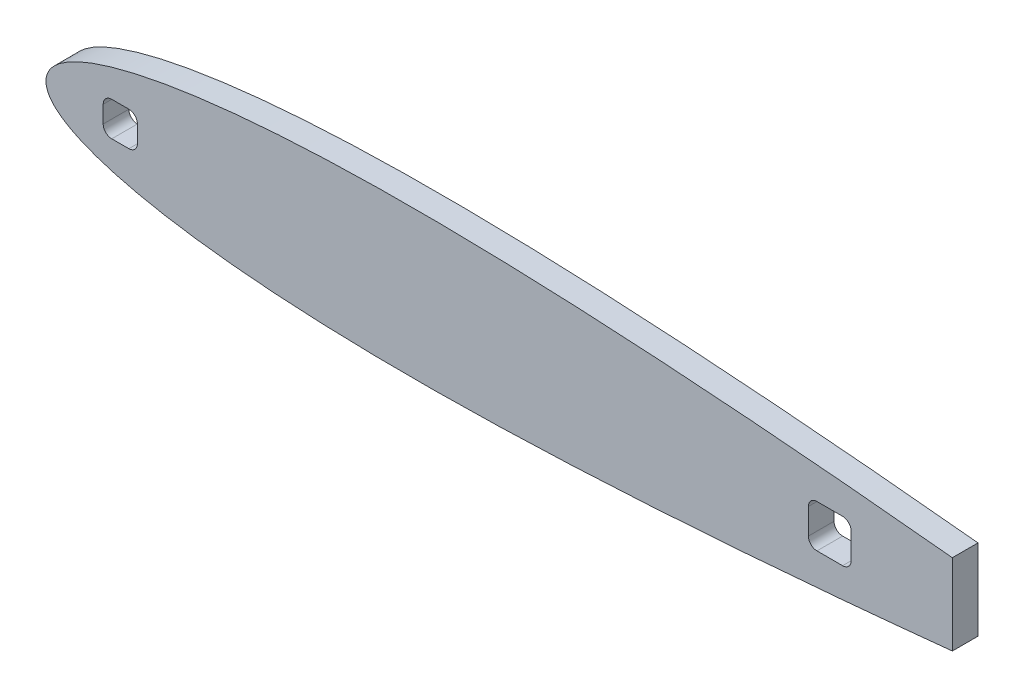
ISO-10303-21;
HEADER;
FILE_DESCRIPTION(('STEP AP214'),'2;1');
FILE_NAME('part.step','',(''),(''),'','','');
FILE_SCHEMA(('AUTOMOTIVE_DESIGN { 1 0 10303 214 1 1 1 1 }'));
ENDSEC;
DATA;
#1=APPLICATION_CONTEXT('core data for automotive mechanical design processes');
#2=APPLICATION_PROTOCOL_DEFINITION('international standard','automotive_design',2000,#1);
#3=PRODUCT_CONTEXT('',#1,'mechanical');
#4=PRODUCT('Part','Part','',(#3));
#5=PRODUCT_RELATED_PRODUCT_CATEGORY('part','',(#4));
#6=PRODUCT_DEFINITION_FORMATION('','',#4);
#7=PRODUCT_DEFINITION_CONTEXT('part definition',#1,'design');
#8=PRODUCT_DEFINITION('design','',#6,#7);
#9=PRODUCT_DEFINITION_SHAPE('','',#8);
#10=(LENGTH_UNIT() NAMED_UNIT(*) SI_UNIT(.MILLI.,.METRE.));
#11=(NAMED_UNIT(*) PLANE_ANGLE_UNIT() SI_UNIT($,.RADIAN.));
#12=(NAMED_UNIT(*) SI_UNIT($,.STERADIAN.) SOLID_ANGLE_UNIT());
#13=UNCERTAINTY_MEASURE_WITH_UNIT(LENGTH_MEASURE(1.E-05),#10,'distance_accuracy_value','');
#14=(GEOMETRIC_REPRESENTATION_CONTEXT(3) GLOBAL_UNCERTAINTY_ASSIGNED_CONTEXT((#13)) GLOBAL_UNIT_ASSIGNED_CONTEXT((#10,
#11,#12)) REPRESENTATION_CONTEXT('',''));
#15=CARTESIAN_POINT('',(0.,0.,0.));
#16=DIRECTION('',(0.,0.,1.));
#17=DIRECTION('',(1.,0.,0.));
#18=AXIS2_PLACEMENT_3D('',#15,#16,#17);
#19=CARTESIAN_POINT('',(211.979999999811,5.60261101752977E-12,6.));
#20=DIRECTION('',(1.,0.,0.));
#21=DIRECTION('',(0.,1.,0.));
#22=AXIS2_PLACEMENT_3D('',#19,#20,#21);
#23=PLANE('',#22);
#24=DIRECTION('',(0.,-1.,0.));
#25=VECTOR('',#24,1.);
#26=CARTESIAN_POINT('',(211.979999999811,5.60261101752977E-12,0.));
#27=LINE('',#26,#25);
#28=CARTESIAN_POINT('',(211.97999999981,9.45142222176065,0.));
#29=VERTEX_POINT('',#28);
#30=CARTESIAN_POINT('',(211.979999999811,-9.45142222176061,0.));
#31=VERTEX_POINT('',#30);
#32=EDGE_CURVE('E342',#29,#31,#27,.T.);
#33=ORIENTED_EDGE('',*,*,#32,.F.);
#34=DIRECTION('',(0.,0.,-1.));
#35=VECTOR('',#34,1.);
#36=CARTESIAN_POINT('',(211.97999999981,9.45142222176065,6.));
#37=LINE('',#36,#35);
#38=CARTESIAN_POINT('',(211.97999999981,9.45142222176065,6.));
#39=VERTEX_POINT('',#38);
#40=EDGE_CURVE('E11',#39,#29,#37,.T.);
#41=ORIENTED_EDGE('',*,*,#40,.F.);
#42=DIRECTION('',(0.,-1.,0.));
#43=VECTOR('',#42,1.);
#44=CARTESIAN_POINT('',(211.979999999811,5.60261101752977E-12,6.));
#45=LINE('',#44,#43);
#46=CARTESIAN_POINT('',(211.979999999811,-9.45142222176061,6.));
#47=VERTEX_POINT('',#46);
#48=EDGE_CURVE('E180',#39,#47,#45,.T.);
#49=ORIENTED_EDGE('',*,*,#48,.T.);
#50=DIRECTION('',(0.,0.,-1.));
#51=VECTOR('',#50,1.);
#52=CARTESIAN_POINT('',(211.979999999811,-9.45142222176061,6.));
#53=LINE('',#52,#51);
#54=EDGE_CURVE('E45',#47,#31,#53,.T.);
#55=ORIENTED_EDGE('',*,*,#54,.T.);
#56=EDGE_LOOP('',(#33,#41,#49,#55));
#57=FACE_BOUND('',#56,.T.);
#58=ADVANCED_FACE('F35',(#57),#23,.T.);
#59=CARTESIAN_POINT('',(13.38,0.,6.));
#60=DIRECTION('',(-1.,0.,0.));
#61=DIRECTION('',(0.,0.,1.));
#62=AXIS2_PLACEMENT_3D('',#59,#60,#61);
#63=PLANE('',#62);
#64=DIRECTION('',(0.,1.,0.));
#65=VECTOR('',#64,1.);
#66=CARTESIAN_POINT('',(13.38,0.,0.));
#67=LINE('',#66,#65);
#68=CARTESIAN_POINT('',(13.38,-1.99999999999999,0.));
#69=VERTEX_POINT('',#68);
#70=CARTESIAN_POINT('',(13.38,1.99999999999998,0.));
#71=VERTEX_POINT('',#70);
#72=EDGE_CURVE('E323',#69,#71,#67,.T.);
#73=ORIENTED_EDGE('',*,*,#72,.T.);
#74=DIRECTION('',(0.,0.,-1.));
#75=VECTOR('',#74,1.);
#76=CARTESIAN_POINT('',(13.38,1.99999999999998,6.));
#77=LINE('',#76,#75);
#78=CARTESIAN_POINT('',(13.38,1.99999999999998,6.));
#79=VERTEX_POINT('',#78);
#80=EDGE_CURVE('E194',#79,#71,#77,.T.);
#81=ORIENTED_EDGE('',*,*,#80,.F.);
#82=DIRECTION('',(0.,1.,0.));
#83=VECTOR('',#82,1.);
#84=CARTESIAN_POINT('',(13.38,0.,6.));
#85=LINE('',#84,#83);
#86=CARTESIAN_POINT('',(13.38,-1.99999999999999,6.));
#87=VERTEX_POINT('',#86);
#88=EDGE_CURVE('E174',#87,#79,#85,.T.);
#89=ORIENTED_EDGE('',*,*,#88,.F.);
#90=DIRECTION('',(0.,0.,-1.));
#91=VECTOR('',#90,1.);
#92=CARTESIAN_POINT('',(13.38,-1.99999999999999,6.));
#93=LINE('',#92,#91);
#94=EDGE_CURVE('E183',#87,#69,#93,.T.);
#95=ORIENTED_EDGE('',*,*,#94,.T.);
#96=EDGE_LOOP('',(#73,#81,#89,#95));
#97=FACE_BOUND('',#96,.T.);
#98=ADVANCED_FACE('F192',(#97),#63,.F.);
#99=CARTESIAN_POINT('',(15.38,2.,6.));
#100=DIRECTION('',(0.,0.,-1.));
#101=DIRECTION('',(-1.,0.,0.));
#102=AXIS2_PLACEMENT_3D('',#99,#100,#101);
#103=CYLINDRICAL_SURFACE('',#102,2.);
#104=CARTESIAN_POINT('',(15.38,2.,0.));
#105=DIRECTION('',(0.,0.,1.));
#106=DIRECTION('',(1.,0.,0.));
#107=AXIS2_PLACEMENT_3D('',#104,#105,#106);
#108=CIRCLE('',#107,2.);
#109=CARTESIAN_POINT('',(15.38,4.,0.));
#110=VERTEX_POINT('',#109);
#111=EDGE_CURVE('E325',#71,#110,#108,.F.);
#112=ORIENTED_EDGE('',*,*,#111,.T.);
#113=DIRECTION('',(0.,0.,-1.));
#114=VECTOR('',#113,1.);
#115=CARTESIAN_POINT('',(15.38,4.,6.));
#116=LINE('',#115,#114);
#117=CARTESIAN_POINT('',(15.38,4.,6.));
#118=VERTEX_POINT('',#117);
#119=EDGE_CURVE('E364',#118,#110,#116,.T.);
#120=ORIENTED_EDGE('',*,*,#119,.F.);
#121=CARTESIAN_POINT('',(15.38,2.,6.));
#122=DIRECTION('',(0.,0.,1.));
#123=DIRECTION('',(1.,0.,0.));
#124=AXIS2_PLACEMENT_3D('',#121,#122,#123);
#125=CIRCLE('',#124,2.);
#126=EDGE_CURVE('E195',#79,#118,#125,.F.);
#127=ORIENTED_EDGE('',*,*,#126,.F.);
#128=ORIENTED_EDGE('',*,*,#80,.T.);
#129=EDGE_LOOP('',(#112,#120,#127,#128));
#130=FACE_BOUND('',#129,.T.);
#131=ADVANCED_FACE('F257',(#130),#103,.F.);
#132=CARTESIAN_POINT('',(0.,4.,6.));
#133=DIRECTION('',(0.,1.,0.));
#134=DIRECTION('',(0.,0.,1.));
#135=AXIS2_PLACEMENT_3D('',#132,#133,#134);
#136=PLANE('',#135);
#137=DIRECTION('',(1.,0.,0.));
#138=VECTOR('',#137,1.);
#139=CARTESIAN_POINT('',(0.,4.,0.));
#140=LINE('',#139,#138);
#141=CARTESIAN_POINT('',(19.38,4.,0.));
#142=VERTEX_POINT('',#141);
#143=EDGE_CURVE('E327',#110,#142,#140,.T.);
#144=ORIENTED_EDGE('',*,*,#143,.T.);
#145=DIRECTION('',(0.,0.,-1.));
#146=VECTOR('',#145,1.);
#147=CARTESIAN_POINT('',(19.38,4.,6.));
#148=LINE('',#147,#146);
#149=CARTESIAN_POINT('',(19.38,4.,6.));
#150=VERTEX_POINT('',#149);
#151=EDGE_CURVE('E361',#150,#142,#148,.T.);
#152=ORIENTED_EDGE('',*,*,#151,.F.);
#153=DIRECTION('',(1.,0.,0.));
#154=VECTOR('',#153,1.);
#155=CARTESIAN_POINT('',(0.,4.,6.));
#156=LINE('',#155,#154);
#157=EDGE_CURVE('E198',#118,#150,#156,.T.);
#158=ORIENTED_EDGE('',*,*,#157,.F.);
#159=ORIENTED_EDGE('',*,*,#119,.T.);
#160=EDGE_LOOP('',(#144,#152,#158,#159));
#161=FACE_BOUND('',#160,.T.);
#162=ADVANCED_FACE('F253',(#161),#136,.F.);
#163=CARTESIAN_POINT('',(19.38,2.,6.));
#164=DIRECTION('',(0.,0.,-1.));
#165=DIRECTION('',(-1.,0.,0.));
#166=AXIS2_PLACEMENT_3D('',#163,#164,#165);
#167=CYLINDRICAL_SURFACE('',#166,2.);
#168=CARTESIAN_POINT('',(19.38,2.,0.));
#169=DIRECTION('',(0.,0.,1.));
#170=DIRECTION('',(1.,0.,0.));
#171=AXIS2_PLACEMENT_3D('',#168,#169,#170);
#172=CIRCLE('',#171,2.);
#173=CARTESIAN_POINT('',(21.38,1.99999999999998,0.));
#174=VERTEX_POINT('',#173);
#175=EDGE_CURVE('E329',#142,#174,#172,.F.);
#176=ORIENTED_EDGE('',*,*,#175,.T.);
#177=DIRECTION('',(0.,0.,-1.));
#178=VECTOR('',#177,1.);
#179=CARTESIAN_POINT('',(21.38,1.99999999999998,6.));
#180=LINE('',#179,#178);
#181=CARTESIAN_POINT('',(21.38,1.99999999999998,6.));
#182=VERTEX_POINT('',#181);
#183=EDGE_CURVE('E359',#182,#174,#180,.T.);
#184=ORIENTED_EDGE('',*,*,#183,.F.);
#185=CARTESIAN_POINT('',(19.38,2.,6.));
#186=DIRECTION('',(0.,0.,1.));
#187=DIRECTION('',(1.,0.,0.));
#188=AXIS2_PLACEMENT_3D('',#185,#186,#187);
#189=CIRCLE('',#188,2.);
#190=EDGE_CURVE('E205',#150,#182,#189,.F.);
#191=ORIENTED_EDGE('',*,*,#190,.F.);
#192=ORIENTED_EDGE('',*,*,#151,.T.);
#193=EDGE_LOOP('',(#176,#184,#191,#192));
#194=FACE_BOUND('',#193,.T.);
#195=ADVANCED_FACE('F249',(#194),#167,.F.);
#196=CARTESIAN_POINT('',(21.38,0.,6.));
#197=DIRECTION('',(-1.,0.,0.));
#198=DIRECTION('',(0.,0.,1.));
#199=AXIS2_PLACEMENT_3D('',#196,#197,#198);
#200=PLANE('',#199);
#201=DIRECTION('',(0.,1.,0.));
#202=VECTOR('',#201,1.);
#203=CARTESIAN_POINT('',(21.38,0.,0.));
#204=LINE('',#203,#202);
#205=CARTESIAN_POINT('',(21.38,-1.99999999999999,0.));
#206=VERTEX_POINT('',#205);
#207=EDGE_CURVE('E332',#206,#174,#204,.T.);
#208=ORIENTED_EDGE('',*,*,#207,.F.);
#209=DIRECTION('',(0.,0.,-1.));
#210=VECTOR('',#209,1.);
#211=CARTESIAN_POINT('',(21.38,-1.99999999999999,6.));
#212=LINE('',#211,#210);
#213=CARTESIAN_POINT('',(21.38,-1.99999999999999,6.));
#214=VERTEX_POINT('',#213);
#215=EDGE_CURVE('E357',#214,#206,#212,.T.);
#216=ORIENTED_EDGE('',*,*,#215,.F.);
#217=DIRECTION('',(0.,1.,0.));
#218=VECTOR('',#217,1.);
#219=CARTESIAN_POINT('',(21.38,0.,6.));
#220=LINE('',#219,#218);
#221=EDGE_CURVE('E207',#214,#182,#220,.T.);
#222=ORIENTED_EDGE('',*,*,#221,.T.);
#223=ORIENTED_EDGE('',*,*,#183,.T.);
#224=EDGE_LOOP('',(#208,#216,#222,#223));
#225=FACE_BOUND('',#224,.T.);
#226=ADVANCED_FACE('F245',(#225),#200,.T.);
#227=CARTESIAN_POINT('',(19.38,-2.,6.));
#228=DIRECTION('',(0.,0.,-1.));
#229=DIRECTION('',(-1.,0.,0.));
#230=AXIS2_PLACEMENT_3D('',#227,#228,#229);
#231=CYLINDRICAL_SURFACE('',#230,2.);
#232=CARTESIAN_POINT('',(19.38,-2.,0.));
#233=DIRECTION('',(0.,0.,1.));
#234=DIRECTION('',(1.,0.,0.));
#235=AXIS2_PLACEMENT_3D('',#232,#233,#234);
#236=CIRCLE('',#235,2.);
#237=CARTESIAN_POINT('',(19.38,-4.,0.));
#238=VERTEX_POINT('',#237);
#239=EDGE_CURVE('E335',#238,#206,#236,.T.);
#240=ORIENTED_EDGE('',*,*,#239,.F.);
#241=DIRECTION('',(0.,0.,-1.));
#242=VECTOR('',#241,1.);
#243=CARTESIAN_POINT('',(19.38,-4.,6.));
#244=LINE('',#243,#242);
#245=CARTESIAN_POINT('',(19.38,-4.,6.));
#246=VERTEX_POINT('',#245);
#247=EDGE_CURVE('E355',#246,#238,#244,.T.);
#248=ORIENTED_EDGE('',*,*,#247,.F.);
#249=CARTESIAN_POINT('',(19.38,-2.,6.));
#250=DIRECTION('',(0.,0.,1.));
#251=DIRECTION('',(1.,0.,0.));
#252=AXIS2_PLACEMENT_3D('',#249,#250,#251);
#253=CIRCLE('',#252,2.);
#254=EDGE_CURVE('E210',#246,#214,#253,.T.);
#255=ORIENTED_EDGE('',*,*,#254,.T.);
#256=ORIENTED_EDGE('',*,*,#215,.T.);
#257=EDGE_LOOP('',(#240,#248,#255,#256));
#258=FACE_BOUND('',#257,.T.);
#259=ADVANCED_FACE('F241',(#258),#231,.F.);
#260=CARTESIAN_POINT('',(0.,-4.,6.));
#261=DIRECTION('',(0.,1.,0.));
#262=DIRECTION('',(0.,0.,1.));
#263=AXIS2_PLACEMENT_3D('',#260,#261,#262);
#264=PLANE('',#263);
#265=DIRECTION('',(1.,0.,0.));
#266=VECTOR('',#265,1.);
#267=CARTESIAN_POINT('',(0.,-4.,0.));
#268=LINE('',#267,#266);
#269=CARTESIAN_POINT('',(15.38,-4.,0.));
#270=VERTEX_POINT('',#269);
#271=EDGE_CURVE('E338',#270,#238,#268,.T.);
#272=ORIENTED_EDGE('',*,*,#271,.F.);
#273=DIRECTION('',(0.,0.,-1.));
#274=VECTOR('',#273,1.);
#275=CARTESIAN_POINT('',(15.38,-4.,6.));
#276=LINE('',#275,#274);
#277=CARTESIAN_POINT('',(15.38,-4.,6.));
#278=VERTEX_POINT('',#277);
#279=EDGE_CURVE('E190',#278,#270,#276,.T.);
#280=ORIENTED_EDGE('',*,*,#279,.F.);
#281=DIRECTION('',(1.,0.,0.));
#282=VECTOR('',#281,1.);
#283=CARTESIAN_POINT('',(0.,-4.,6.));
#284=LINE('',#283,#282);
#285=EDGE_CURVE('E178',#278,#246,#284,.T.);
#286=ORIENTED_EDGE('',*,*,#285,.T.);
#287=ORIENTED_EDGE('',*,*,#247,.T.);
#288=EDGE_LOOP('',(#272,#280,#286,#287));
#289=FACE_BOUND('',#288,.T.);
#290=ADVANCED_FACE('F238',(#289),#264,.T.);
#291=CARTESIAN_POINT('',(178.31333333,0.,6.));
#292=DIRECTION('',(-1.,0.,0.));
#293=DIRECTION('',(0.,0.,1.));
#294=AXIS2_PLACEMENT_3D('',#291,#292,#293);
#295=PLANE('',#294);
#296=DIRECTION('',(0.,1.,0.));
#297=VECTOR('',#296,1.);
#298=CARTESIAN_POINT('',(178.31333333,0.,0.));
#299=LINE('',#298,#297);
#300=CARTESIAN_POINT('',(178.31333333,-3.,0.));
#301=VERTEX_POINT('',#300);
#302=CARTESIAN_POINT('',(178.31333333,2.99999999999997,0.));
#303=VERTEX_POINT('',#302);
#304=EDGE_CURVE('E220',#301,#303,#299,.T.);
#305=ORIENTED_EDGE('',*,*,#304,.T.);
#306=DIRECTION('',(0.,0.,-1.));
#307=VECTOR('',#306,1.);
#308=CARTESIAN_POINT('',(178.31333333,2.99999999999997,6.));
#309=LINE('',#308,#307);
#310=CARTESIAN_POINT('',(178.31333333,2.99999999999997,6.));
#311=VERTEX_POINT('',#310);
#312=EDGE_CURVE('E39',#311,#303,#309,.T.);
#313=ORIENTED_EDGE('',*,*,#312,.F.);
#314=DIRECTION('',(0.,1.,0.));
#315=VECTOR('',#314,1.);
#316=CARTESIAN_POINT('',(178.31333333,0.,6.));
#317=LINE('',#316,#315);
#318=CARTESIAN_POINT('',(178.31333333,-3.,6.));
#319=VERTEX_POINT('',#318);
#320=EDGE_CURVE('E349',#319,#311,#317,.T.);
#321=ORIENTED_EDGE('',*,*,#320,.F.);
#322=DIRECTION('',(0.,0.,-1.));
#323=VECTOR('',#322,1.);
#324=CARTESIAN_POINT('',(178.31333333,-3.,6.));
#325=LINE('',#324,#323);
#326=EDGE_CURVE('E219',#319,#301,#325,.T.);
#327=ORIENTED_EDGE('',*,*,#326,.T.);
#328=EDGE_LOOP('',(#305,#313,#321,#327));
#329=FACE_BOUND('',#328,.T.);
#330=ADVANCED_FACE('F37',(#329),#295,.F.);
#331=CARTESIAN_POINT('',(180.31333333,2.99999999999999,6.));
#332=DIRECTION('',(0.,0.,-1.));
#333=DIRECTION('',(-1.,0.,0.));
#334=AXIS2_PLACEMENT_3D('',#331,#332,#333);
#335=CYLINDRICAL_SURFACE('',#334,2.);
#336=CARTESIAN_POINT('',(180.31333333,2.99999999999999,0.));
#337=DIRECTION('',(0.,0.,1.));
#338=DIRECTION('',(1.,0.,0.));
#339=AXIS2_PLACEMENT_3D('',#336,#337,#338);
#340=CIRCLE('',#339,2.);
#341=CARTESIAN_POINT('',(180.31333333,4.99999999999999,0.));
#342=VERTEX_POINT('',#341);
#343=EDGE_CURVE('E291',#303,#342,#340,.F.);
#344=ORIENTED_EDGE('',*,*,#343,.T.);
#345=DIRECTION('',(0.,0.,-1.));
#346=VECTOR('',#345,1.);
#347=CARTESIAN_POINT('',(180.31333333,4.99999999999999,6.));
#348=LINE('',#347,#346);
#349=CARTESIAN_POINT('',(180.31333333,4.99999999999999,6.));
#350=VERTEX_POINT('',#349);
#351=EDGE_CURVE('E293',#350,#342,#348,.T.);
#352=ORIENTED_EDGE('',*,*,#351,.F.);
#353=CARTESIAN_POINT('',(180.31333333,2.99999999999999,6.));
#354=DIRECTION('',(0.,0.,1.));
#355=DIRECTION('',(1.,0.,0.));
#356=AXIS2_PLACEMENT_3D('',#353,#354,#355);
#357=CIRCLE('',#356,2.);
#358=EDGE_CURVE('E123',#311,#350,#357,.F.);
#359=ORIENTED_EDGE('',*,*,#358,.F.);
#360=ORIENTED_EDGE('',*,*,#312,.T.);
#361=EDGE_LOOP('',(#344,#352,#359,#360));
#362=FACE_BOUND('',#361,.T.);
#363=ADVANCED_FACE('F284',(#362),#335,.F.);
#364=CARTESIAN_POINT('',(0.,4.99999999999999,6.));
#365=DIRECTION('',(0.,1.,0.));
#366=DIRECTION('',(0.,0.,1.));
#367=AXIS2_PLACEMENT_3D('',#364,#365,#366);
#368=PLANE('',#367);
#369=DIRECTION('',(1.,0.,0.));
#370=VECTOR('',#369,1.);
#371=CARTESIAN_POINT('',(0.,4.99999999999999,0.));
#372=LINE('',#371,#370);
#373=CARTESIAN_POINT('',(186.31333333,4.99999999999999,0.));
#374=VERTEX_POINT('',#373);
#375=EDGE_CURVE('E300',#342,#374,#372,.T.);
#376=ORIENTED_EDGE('',*,*,#375,.T.);
#377=DIRECTION('',(0.,0.,-1.));
#378=VECTOR('',#377,1.);
#379=CARTESIAN_POINT('',(186.31333333,4.99999999999999,6.));
#380=LINE('',#379,#378);
#381=CARTESIAN_POINT('',(186.31333333,4.99999999999999,6.));
#382=VERTEX_POINT('',#381);
#383=EDGE_CURVE('E304',#382,#374,#380,.T.);
#384=ORIENTED_EDGE('',*,*,#383,.F.);
#385=DIRECTION('',(1.,0.,0.));
#386=VECTOR('',#385,1.);
#387=CARTESIAN_POINT('',(0.,4.99999999999999,6.));
#388=LINE('',#387,#386);
#389=EDGE_CURVE('E303',#350,#382,#388,.T.);
#390=ORIENTED_EDGE('',*,*,#389,.F.);
#391=ORIENTED_EDGE('',*,*,#351,.T.);
#392=EDGE_LOOP('',(#376,#384,#390,#391));
#393=FACE_BOUND('',#392,.T.);
#394=ADVANCED_FACE('F281',(#393),#368,.F.);
#395=CARTESIAN_POINT('',(186.31333333,2.99999999999999,6.));
#396=DIRECTION('',(0.,0.,-1.));
#397=DIRECTION('',(-1.,0.,0.));
#398=AXIS2_PLACEMENT_3D('',#395,#396,#397);
#399=CYLINDRICAL_SURFACE('',#398,2.);
#400=CARTESIAN_POINT('',(186.31333333,2.99999999999999,0.));
#401=DIRECTION('',(0.,0.,1.));
#402=DIRECTION('',(1.,0.,0.));
#403=AXIS2_PLACEMENT_3D('',#400,#401,#402);
#404=CIRCLE('',#403,2.);
#405=CARTESIAN_POINT('',(188.31333333,2.99999999999997,0.));
#406=VERTEX_POINT('',#405);
#407=EDGE_CURVE('E309',#374,#406,#404,.F.);
#408=ORIENTED_EDGE('',*,*,#407,.T.);
#409=DIRECTION('',(0.,0.,-1.));
#410=VECTOR('',#409,1.);
#411=CARTESIAN_POINT('',(188.31333333,2.99999999999997,6.));
#412=LINE('',#411,#410);
#413=CARTESIAN_POINT('',(188.31333333,2.99999999999997,6.));
#414=VERTEX_POINT('',#413);
#415=EDGE_CURVE('E376',#414,#406,#412,.T.);
#416=ORIENTED_EDGE('',*,*,#415,.F.);
#417=CARTESIAN_POINT('',(186.31333333,2.99999999999999,6.));
#418=DIRECTION('',(0.,0.,1.));
#419=DIRECTION('',(1.,0.,0.));
#420=AXIS2_PLACEMENT_3D('',#417,#418,#419);
#421=CIRCLE('',#420,2.);
#422=EDGE_CURVE('E380',#382,#414,#421,.F.);
#423=ORIENTED_EDGE('',*,*,#422,.F.);
#424=ORIENTED_EDGE('',*,*,#383,.T.);
#425=EDGE_LOOP('',(#408,#416,#423,#424));
#426=FACE_BOUND('',#425,.T.);
#427=ADVANCED_FACE('F277',(#426),#399,.F.);
#428=CARTESIAN_POINT('',(188.31333333,0.,6.));
#429=DIRECTION('',(-1.,0.,0.));
#430=DIRECTION('',(0.,0.,1.));
#431=AXIS2_PLACEMENT_3D('',#428,#429,#430);
#432=PLANE('',#431);
#433=DIRECTION('',(0.,1.,0.));
#434=VECTOR('',#433,1.);
#435=CARTESIAN_POINT('',(188.31333333,0.,0.));
#436=LINE('',#435,#434);
#437=CARTESIAN_POINT('',(188.31333333,-3.,0.));
#438=VERTEX_POINT('',#437);
#439=EDGE_CURVE('E311',#438,#406,#436,.T.);
#440=ORIENTED_EDGE('',*,*,#439,.F.);
#441=DIRECTION('',(0.,0.,-1.));
#442=VECTOR('',#441,1.);
#443=CARTESIAN_POINT('',(188.31333333,-3.,6.));
#444=LINE('',#443,#442);
#445=CARTESIAN_POINT('',(188.31333333,-3.,6.));
#446=VERTEX_POINT('',#445);
#447=EDGE_CURVE('E374',#446,#438,#444,.T.);
#448=ORIENTED_EDGE('',*,*,#447,.F.);
#449=DIRECTION('',(0.,1.,0.));
#450=VECTOR('',#449,1.);
#451=CARTESIAN_POINT('',(188.31333333,0.,6.));
#452=LINE('',#451,#450);
#453=EDGE_CURVE('E384',#446,#414,#452,.T.);
#454=ORIENTED_EDGE('',*,*,#453,.T.);
#455=ORIENTED_EDGE('',*,*,#415,.T.);
#456=EDGE_LOOP('',(#440,#448,#454,#455));
#457=FACE_BOUND('',#456,.T.);
#458=ADVANCED_FACE('F273',(#457),#432,.T.);
#459=CARTESIAN_POINT('',(186.31333333,-3.00000000000001,6.));
#460=DIRECTION('',(0.,0.,-1.));
#461=DIRECTION('',(-1.,0.,0.));
#462=AXIS2_PLACEMENT_3D('',#459,#460,#461);
#463=CYLINDRICAL_SURFACE('',#462,2.);
#464=CARTESIAN_POINT('',(186.31333333,-3.00000000000001,0.));
#465=DIRECTION('',(0.,0.,1.));
#466=DIRECTION('',(1.,0.,0.));
#467=AXIS2_PLACEMENT_3D('',#464,#465,#466);
#468=CIRCLE('',#467,2.);
#469=CARTESIAN_POINT('',(186.31333333,-5.00000000000001,0.));
#470=VERTEX_POINT('',#469);
#471=EDGE_CURVE('E315',#470,#438,#468,.T.);
#472=ORIENTED_EDGE('',*,*,#471,.F.);
#473=DIRECTION('',(0.,0.,-1.));
#474=VECTOR('',#473,1.);
#475=CARTESIAN_POINT('',(186.31333333,-5.00000000000001,6.));
#476=LINE('',#475,#474);
#477=CARTESIAN_POINT('',(186.31333333,-5.00000000000001,6.));
#478=VERTEX_POINT('',#477);
#479=EDGE_CURVE('E372',#478,#470,#476,.T.);
#480=ORIENTED_EDGE('',*,*,#479,.F.);
#481=CARTESIAN_POINT('',(186.31333333,-3.00000000000001,6.));
#482=DIRECTION('',(0.,0.,1.));
#483=DIRECTION('',(1.,0.,0.));
#484=AXIS2_PLACEMENT_3D('',#481,#482,#483);
#485=CIRCLE('',#484,2.);
#486=EDGE_CURVE('E386',#478,#446,#485,.T.);
#487=ORIENTED_EDGE('',*,*,#486,.T.);
#488=ORIENTED_EDGE('',*,*,#447,.T.);
#489=EDGE_LOOP('',(#472,#480,#487,#488));
#490=FACE_BOUND('',#489,.T.);
#491=ADVANCED_FACE('F269',(#490),#463,.F.);
#492=CARTESIAN_POINT('',(0.,-5.00000000000001,6.));
#493=DIRECTION('',(0.,1.,0.));
#494=DIRECTION('',(0.,0.,1.));
#495=AXIS2_PLACEMENT_3D('',#492,#493,#494);
#496=PLANE('',#495);
#497=DIRECTION('',(1.,0.,0.));
#498=VECTOR('',#497,1.);
#499=CARTESIAN_POINT('',(0.,-5.00000000000001,0.));
#500=LINE('',#499,#498);
#501=CARTESIAN_POINT('',(180.31333333,-5.00000000000001,0.));
#502=VERTEX_POINT('',#501);
#503=EDGE_CURVE('E318',#502,#470,#500,.T.);
#504=ORIENTED_EDGE('',*,*,#503,.F.);
#505=DIRECTION('',(0.,0.,-1.));
#506=VECTOR('',#505,1.);
#507=CARTESIAN_POINT('',(180.31333333,-5.00000000000001,6.));
#508=LINE('',#507,#506);
#509=CARTESIAN_POINT('',(180.31333333,-5.00000000000001,6.));
#510=VERTEX_POINT('',#509);
#511=EDGE_CURVE('E370',#510,#502,#508,.T.);
#512=ORIENTED_EDGE('',*,*,#511,.F.);
#513=DIRECTION('',(1.,0.,0.));
#514=VECTOR('',#513,1.);
#515=CARTESIAN_POINT('',(0.,-5.00000000000001,6.));
#516=LINE('',#515,#514);
#517=EDGE_CURVE('E200',#510,#478,#516,.T.);
#518=ORIENTED_EDGE('',*,*,#517,.T.);
#519=ORIENTED_EDGE('',*,*,#479,.T.);
#520=EDGE_LOOP('',(#504,#512,#518,#519));
#521=FACE_BOUND('',#520,.T.);
#522=ADVANCED_FACE('F237',(#521),#496,.T.);
#523=CARTESIAN_POINT('',(15.38,-2.,6.));
#524=DIRECTION('',(0.,0.,-1.));
#525=DIRECTION('',(-1.,0.,0.));
#526=AXIS2_PLACEMENT_3D('',#523,#524,#525);
#527=CYLINDRICAL_SURFACE('',#526,2.);
#528=CARTESIAN_POINT('',(15.38,-2.,0.));
#529=DIRECTION('',(0.,0.,1.));
#530=DIRECTION('',(1.,0.,0.));
#531=AXIS2_PLACEMENT_3D('',#528,#529,#530);
#532=CIRCLE('',#531,2.);
#533=EDGE_CURVE('E186',#270,#69,#532,.F.);
#534=ORIENTED_EDGE('',*,*,#533,.T.);
#535=ORIENTED_EDGE('',*,*,#94,.F.);
#536=CARTESIAN_POINT('',(15.38,-2.,6.));
#537=DIRECTION('',(0.,0.,1.));
#538=DIRECTION('',(1.,0.,0.));
#539=AXIS2_PLACEMENT_3D('',#536,#537,#538);
#540=CIRCLE('',#539,2.);
#541=EDGE_CURVE('E170',#278,#87,#540,.F.);
#542=ORIENTED_EDGE('',*,*,#541,.F.);
#543=ORIENTED_EDGE('',*,*,#279,.T.);
#544=EDGE_LOOP('',(#534,#535,#542,#543));
#545=FACE_BOUND('',#544,.T.);
#546=ADVANCED_FACE('F184',(#545),#527,.F.);
#547=CARTESIAN_POINT('',(180.31333333,-3.00000000000001,6.));
#548=DIRECTION('',(0.,0.,-1.));
#549=DIRECTION('',(-1.,0.,0.));
#550=AXIS2_PLACEMENT_3D('',#547,#548,#549);
#551=CYLINDRICAL_SURFACE('',#550,2.);
#552=CARTESIAN_POINT('',(180.31333333,-3.00000000000001,0.));
#553=DIRECTION('',(0.,0.,1.));
#554=DIRECTION('',(1.,0.,0.));
#555=AXIS2_PLACEMENT_3D('',#552,#553,#554);
#556=CIRCLE('',#555,2.);
#557=EDGE_CURVE('E321',#502,#301,#556,.F.);
#558=ORIENTED_EDGE('',*,*,#557,.T.);
#559=ORIENTED_EDGE('',*,*,#326,.F.);
#560=CARTESIAN_POINT('',(180.31333333,-3.00000000000001,6.));
#561=DIRECTION('',(0.,0.,1.));
#562=DIRECTION('',(1.,0.,0.));
#563=AXIS2_PLACEMENT_3D('',#560,#561,#562);
#564=CIRCLE('',#563,2.);
#565=EDGE_CURVE('E196',#510,#319,#564,.F.);
#566=ORIENTED_EDGE('',*,*,#565,.F.);
#567=ORIENTED_EDGE('',*,*,#511,.T.);
#568=EDGE_LOOP('',(#558,#559,#566,#567));
#569=FACE_BOUND('',#568,.T.);
#570=ADVANCED_FACE('F230',(#569),#551,.F.);
#571=CARTESIAN_POINT('',(289.98,0.,6.));
#572=CARTESIAN_POINT('',(289.98,0.120688475747716,6.));
#573=CARTESIAN_POINT('',(288.183005746775,0.249231282611266,6.));
#574=CARTESIAN_POINT('',(287.124428980567,0.401389081871368,6.));
#575=CARTESIAN_POINT('',(286.616845951625,0.471691425398295,6.));
#576=CARTESIAN_POINT('',(285.783243444161,0.588604185583467,6.));
#577=CARTESIAN_POINT('',(284.613786480355,0.751239833356046,6.));
#578=CARTESIAN_POINT('',(283.116873356021,0.957742157733158,6.));
#579=CARTESIAN_POINT('',(281.293809844009,1.2083679186395,6.));
#580=CARTESIAN_POINT('',(279.149529851544,1.50040643137428,6.));
#581=CARTESIAN_POINT('',(276.688806224997,1.83196619720215,6.));
#582=CARTESIAN_POINT('',(273.91757022389,2.20162936140217,6.));
#583=CARTESIAN_POINT('',(270.842229158071,2.60674198264669,6.));
#584=CARTESIAN_POINT('',(267.469959395185,3.04540110526531,6.));
#585=CARTESIAN_POINT('',(263.808563797266,3.51408567962519,6.));
#586=CARTESIAN_POINT('',(259.866653707621,4.01161044522513,6.));
#587=CARTESIAN_POINT('',(255.653406151456,4.53449450393775,6.));
#588=CARTESIAN_POINT('',(251.178699740831,5.08003357078703,6.));
#589=CARTESIAN_POINT('',(246.45301817905,5.64579235196964,6.));
#590=CARTESIAN_POINT('',(241.487366611712,6.2288147201113,6.));
#591=CARTESIAN_POINT('',(236.293160151944,6.82560804194711,6.));
#592=CARTESIAN_POINT('',(230.882825651986,7.43464823438862,6.));
#593=CARTESIAN_POINT('',(225.268829320768,8.05156632164343,6.));
#594=CARTESIAN_POINT('',(219.464460899857,8.67470537489238,6.));
#595=CARTESIAN_POINT('',(213.483049370566,9.29961236762111,6.));
#596=CARTESIAN_POINT('',(207.33869415206,9.92512923145668,6.));
#597=CARTESIAN_POINT('',(201.045670113972,10.546432552672,6.));
#598=CARTESIAN_POINT('',(194.618773944682,11.1615709858625,6.));
#599=CARTESIAN_POINT('',(188.072930048431,11.7662721270179,6.));
#600=CARTESIAN_POINT('',(181.423408251668,12.3585589403471,6.));
#601=CARTESIAN_POINT('',(174.685779509254,12.9335351282961,6.));
#602=CARTESIAN_POINT('',(167.875745184546,13.4886288363811,6.));
#603=CARTESIAN_POINT('',(161.009296544277,14.020295185906,6.));
#604=CARTESIAN_POINT('',(154.102382847857,14.5242662130924,6.));
#605=CARTESIAN_POINT('',(147.171235613193,14.99738104467,6.));
#606=CARTESIAN_POINT('',(140.232034625969,15.4358605342696,6.));
#607=CARTESIAN_POINT('',(133.300841970926,15.8354699974281,6.));
#608=CARTESIAN_POINT('',(126.393974260676,16.1930492722714,6.));
#609=CARTESIAN_POINT('',(119.527405078625,16.5046946658675,6.));
#610=CARTESIAN_POINT('',(112.717227702278,16.7669344282462,6.));
#611=CARTESIAN_POINT('',(105.979449386809,16.9768572447529,6.));
#612=CARTESIAN_POINT('',(99.3297571134074,17.1307290484429,6.));
#613=CARTESIAN_POINT('',(92.7836751377046,17.2258371763092,6.));
#614=CARTESIAN_POINT('',(86.3563327861292,17.2595085181964,6.));
#615=CARTESIAN_POINT('',(80.062867458971,17.2297422459257,6.));
#616=CARTESIAN_POINT('',(73.9180082240873,17.1352000567756,6.));
#617=CARTESIAN_POINT('',(67.9361544615123,16.9730247822307,6.));
#618=CARTESIAN_POINT('',(62.1311437066945,16.7439341032632,6.));
#619=CARTESIAN_POINT('',(56.516521190626,16.446281932145,6.));
#620=CARTESIAN_POINT('',(51.1053584698296,16.0809025513802,6.));
#621=CARTESIAN_POINT('',(45.910397605656,15.6478721354616,6.));
#622=CARTESIAN_POINT('',(40.9437165725183,15.147977744677,6.));
#623=CARTESIAN_POINT('',(36.2168556178421,14.5831156922756,6.));
#624=CARTESIAN_POINT('',(31.7407120029655,13.9555819963139,6.));
#625=CARTESIAN_POINT('',(27.5258304603269,13.2665464236527,6.));
#626=CARTESIAN_POINT('',(23.5818706959089,12.5194526816176,6.));
#627=CARTESIAN_POINT('',(19.9179096766114,11.7171099271683,6.));
#628=CARTESIAN_POINT('',(16.5425103667316,10.8622380577512,6.));
#629=CARTESIAN_POINT('',(13.4631313574501,9.9586667161012,6.));
#630=CARTESIAN_POINT('',(10.6865626684038,9.00939668491573,6.));
#631=CARTESIAN_POINT('',(8.21872548413377,8.01770652996484,6.));
#632=CARTESIAN_POINT('',(6.06450500301712,6.9864570859857,6.));
#633=CARTESIAN_POINT('',(4.22800529566864,5.91779536752643,6.));
#634=CARTESIAN_POINT('',(2.71136488883982,4.81353296442336,6.));
#635=CARTESIAN_POINT('',(1.51751434400426,3.67185342692226,6.));
#636=CARTESIAN_POINT('',(0.649332664151946,2.48952256769731,6.));
#637=CARTESIAN_POINT('',(0.118525016003849,1.26076129217236,6.));
#638=CARTESIAN_POINT('',(-0.0577740557331585,0.,6.));
#639=CARTESIAN_POINT('',(0.118525016003862,-1.26076129217241,6.));
#640=CARTESIAN_POINT('',(0.649332664151921,-2.48952256769726,6.));
#641=CARTESIAN_POINT('',(1.5175143440043,-3.6718534269223,6.));
#642=CARTESIAN_POINT('',(2.71136488883978,-4.81353296442332,6.));
#643=CARTESIAN_POINT('',(4.22800529566868,-5.91779536752646,6.));
#644=CARTESIAN_POINT('',(6.06450500301707,-6.98645708598567,6.));
#645=CARTESIAN_POINT('',(8.2187254841338,-8.01770652996485,6.));
#646=CARTESIAN_POINT('',(10.6865626684038,-9.00939668491573,6.));
#647=CARTESIAN_POINT('',(13.4631313574501,-9.95866671610121,6.));
#648=CARTESIAN_POINT('',(16.5425103667316,-10.8622380577512,6.));
#649=CARTESIAN_POINT('',(19.9179096766114,-11.7171099271683,6.));
#650=CARTESIAN_POINT('',(23.5818706959088,-12.5194526816176,6.));
#651=CARTESIAN_POINT('',(27.5258304603269,-13.2665464236527,6.));
#652=CARTESIAN_POINT('',(31.7407120029655,-13.9555819963139,6.));
#653=CARTESIAN_POINT('',(36.2168556178421,-14.5831156922756,6.));
#654=CARTESIAN_POINT('',(40.9437165725183,-15.1479777446769,6.));
#655=CARTESIAN_POINT('',(45.910397605656,-15.6478721354617,6.));
#656=CARTESIAN_POINT('',(51.1053584698295,-16.0809025513802,6.));
#657=CARTESIAN_POINT('',(56.5165211906261,-16.446281932145,6.));
#658=CARTESIAN_POINT('',(62.1311437066944,-16.7439341032632,6.));
#659=CARTESIAN_POINT('',(67.9361544615123,-16.9730247822307,6.));
#660=CARTESIAN_POINT('',(73.9180082240874,-17.1352000567756,6.));
#661=CARTESIAN_POINT('',(80.062867458971,-17.2297422459257,6.));
#662=CARTESIAN_POINT('',(86.3563327861292,-17.2595085181964,6.));
#663=CARTESIAN_POINT('',(92.7836751377046,-17.2258371763092,6.));
#664=CARTESIAN_POINT('',(99.3297571134074,-17.1307290484429,6.));
#665=CARTESIAN_POINT('',(105.979449386809,-16.9768572447529,6.));
#666=CARTESIAN_POINT('',(112.717227702278,-16.7669344282462,6.));
#667=CARTESIAN_POINT('',(119.527405078625,-16.5046946658676,6.));
#668=CARTESIAN_POINT('',(126.393974260676,-16.1930492722714,6.));
#669=CARTESIAN_POINT('',(133.300841970926,-15.8354699974281,6.));
#670=CARTESIAN_POINT('',(140.232034625969,-15.4358605342696,6.));
#671=CARTESIAN_POINT('',(147.171235613193,-14.99738104467,6.));
#672=CARTESIAN_POINT('',(154.102382847857,-14.5242662130924,6.));
#673=CARTESIAN_POINT('',(161.009296544277,-14.020295185906,6.));
#674=CARTESIAN_POINT('',(167.875745184546,-13.4886288363811,6.));
#675=CARTESIAN_POINT('',(174.685779509254,-12.9335351282961,6.));
#676=CARTESIAN_POINT('',(181.423408251668,-12.3585589403471,6.));
#677=CARTESIAN_POINT('',(188.072930048431,-11.7662721270179,6.));
#678=CARTESIAN_POINT('',(194.618773944682,-11.1615709858625,6.));
#679=CARTESIAN_POINT('',(201.045670113972,-10.546432552672,6.));
#680=CARTESIAN_POINT('',(207.33869415206,-9.92512923145668,6.));
#681=CARTESIAN_POINT('',(213.483049370566,-9.29961236762111,6.));
#682=CARTESIAN_POINT('',(219.464460899857,-8.67470537489238,6.));
#683=CARTESIAN_POINT('',(225.268829320768,-8.05156632164343,6.));
#684=CARTESIAN_POINT('',(230.882825651986,-7.43464823438862,6.));
#685=CARTESIAN_POINT('',(236.293160151944,-6.82560804194712,6.));
#686=CARTESIAN_POINT('',(241.487366611712,-6.22881472011129,6.));
#687=CARTESIAN_POINT('',(246.45301817905,-5.64579235196964,6.));
#688=CARTESIAN_POINT('',(251.178699740831,-5.08003357078703,6.));
#689=CARTESIAN_POINT('',(255.653406151456,-4.53449450393776,6.));
#690=CARTESIAN_POINT('',(259.866653707621,-4.01161044522512,6.));
#691=CARTESIAN_POINT('',(263.808563797266,-3.5140856796252,6.));
#692=CARTESIAN_POINT('',(267.469959395185,-3.0454011052653,6.));
#693=CARTESIAN_POINT('',(270.842229158071,-2.6067419826467,6.));
#694=CARTESIAN_POINT('',(273.91757022389,-2.20162936140218,6.));
#695=CARTESIAN_POINT('',(276.688806224997,-1.83196619720215,6.));
#696=CARTESIAN_POINT('',(279.149529851544,-1.50040643137428,6.));
#697=CARTESIAN_POINT('',(281.293809844009,-1.2083679186395,6.));
#698=CARTESIAN_POINT('',(283.116873356021,-0.95774215773316,6.));
#699=CARTESIAN_POINT('',(284.613786480355,-0.751239833356045,6.));
#700=CARTESIAN_POINT('',(285.783243444161,-0.588604185583472,6.));
#701=CARTESIAN_POINT('',(286.616845951625,-0.471691425398283,6.));
#702=CARTESIAN_POINT('',(287.124428980567,-0.401389081871381,6.));
#703=CARTESIAN_POINT('',(288.183005746776,-0.249231282611217,6.));
#704=CARTESIAN_POINT('',(289.98,-0.120688475747717,6.));
#705=CARTESIAN_POINT('',(289.98,0.,6.));
#706=B_SPLINE_CURVE_WITH_KNOTS('',3,(#571,#572,#573,#574,#575,#576,#577,#578,#579,#580,#581,
#582,#583,#584,#585,#586,#587,#588,#589,#590,#591,#592,#593,#594,#595,#596,#597,#598,#599,#600,
#601,#602,#603,#604,#605,#606,#607,#608,#609,#610,#611,#612,#613,#614,#615,#616,#617,#618,#619,
#620,#621,#622,#623,#624,#625,#626,#627,#628,#629,#630,#631,#632,#633,#634,#635,#636,#637,#638,
#639,#640,#641,#642,#643,#644,#645,#646,#647,#648,#649,#650,#651,#652,#653,#654,#655,#656,#657,
#658,#659,#660,#661,#662,#663,#664,#665,#666,#667,#668,#669,#670,#671,#672,#673,#674,#675,#676,
#677,#678,#679,#680,#681,#682,#683,#684,#685,#686,#687,#688,#689,#690,#691,#692,#693,#694,#695,
#696,#697,#698,#699,#700,#701,#702,#703,#704,#705),.UNSPECIFIED.,.T.,.F.,(4,1,1,1,1,1,1,1,1,1,1,
1,1,1,1,1,1,1,1,1,1,1,1,1,1,1,1,1,1,1,1,1,1,1,1,1,1,1,1,1,1,1,1,1,1,1,1,1,1,1,1,1,1,1,1,1,1,1,1,
1,1,1,1,1,1,1,1,1,1,1,1,1,1,1,1,1,1,1,1,1,1,1,1,1,1,1,1,1,1,1,1,1,1,1,1,1,1,1,1,1,1,1,1,1,1,1,1,
1,1,1,1,1,1,1,1,1,1,1,1,1,1,1,1,1,1,1,1,1,1,1,1,1,4),(0.,0.00440467881085371,0.00469133257481,
0.0055502633064255,0.00697995988186676,0.00897636968334866,0.0115348260887015,
0.0146494200406664,0.0183124682395701,0.0225153297198559,0.0272475070831851,0.0324978969469366,
0.0382539577630278,0.0445020672067612,0.0512268692795786,0.0584133136964432,0.0660434673108266,
0.0740989842954325,0.0825619521215515,0.0914115186602611,0.100627009061137,0.110186574570529,
0.12006757494714,0.130246743047163,0.140700546580995,0.151404252319946,0.162331842025015,
0.173458675406639,0.184758289810525,0.196204076005225,0.207768617646033,0.219425944978466,
0.231147635028262,0.242906359278113,0.254675296434497,0.266426209691092,0.278132454874626,
0.289766476704141,0.301301813903399,0.312711645899721,0.323969258952219,0.335050049689051,
0.345928598532811,0.356580621259731,0.366981996114156,0.377109775983457,0.386942118766526,
0.396457905018667,0.405636644877502,0.414459070098654,0.422906620431988,0.430962851269138,
0.438611617873192,0.445838275000525,0.452630376831336,0.458976172580134,0.464866300151147,
0.470293867958074,0.475254828837889,0.479749124232615,0.48378100591652,0.487362579763427,
0.490515631725442,0.493278565847854,0.495712194393712,0.497909944006567,0.5,0.502090055993433,
0.504287805606288,0.506721434152146,0.509484368274558,0.512637420236574,0.51621899408348,
0.520250875767385,0.524745171162111,0.529706132041926,0.535133699848854,0.541023827419866,
0.547369623168665,0.554161724999475,0.561388382126808,0.569037148730862,0.577093379568012,
0.585540929901347,0.594363355122498,0.603542094981333,0.613057881233474,0.622890224016543,
0.633018003885844,0.643419378740269,0.654071401467189,0.664949950310949,0.676030741047781,
0.687288354100279,0.698698186096602,0.710233523295859,0.721867545125374,0.733573790308909,
0.745324703565504,0.757093640721888,0.768852364971738,0.780574055021534,0.792231382353967,
0.803795923994775,0.815241710189475,0.826541324593361,0.837668157974985,0.848595747680055,
0.859299453419005,0.869753256952837,0.87993242505286,0.889813425429472,0.899372990938863,
0.908588481339739,0.917438047878449,0.925901015704568,0.933956532689174,0.941586686303557,
0.948773130720422,0.955497932793239,0.961746042236972,0.967502103053064,0.972752492916815,
0.977484670280144,0.98168753176043,0.985350579959334,0.988465173911299,0.991023630316651,
0.993020040118133,0.994449736693574,0.99530866742519,0.995595321189146,1.),.UNSPECIFIED.);
#707=DIRECTION('',(0.,0.,-1.));
#708=VECTOR('',#707,1.);
#709=SURFACE_OF_LINEAR_EXTRUSION('',#706,#708);
#710=CARTESIAN_POINT('',(289.98,0.,0.));
#711=CARTESIAN_POINT('',(289.98,0.120688475747716,0.));
#712=CARTESIAN_POINT('',(288.183005746775,0.249231282611266,0.));
#713=CARTESIAN_POINT('',(287.124428980567,0.401389081871368,0.));
#714=CARTESIAN_POINT('',(286.616845951625,0.471691425398295,0.));
#715=CARTESIAN_POINT('',(285.783243444161,0.588604185583467,0.));
#716=CARTESIAN_POINT('',(284.613786480355,0.751239833356046,0.));
#717=CARTESIAN_POINT('',(283.116873356021,0.957742157733158,0.));
#718=CARTESIAN_POINT('',(281.293809844009,1.2083679186395,0.));
#719=CARTESIAN_POINT('',(279.149529851544,1.50040643137428,0.));
#720=CARTESIAN_POINT('',(276.688806224997,1.83196619720215,0.));
#721=CARTESIAN_POINT('',(273.91757022389,2.20162936140217,0.));
#722=CARTESIAN_POINT('',(270.842229158071,2.60674198264669,0.));
#723=CARTESIAN_POINT('',(267.469959395185,3.04540110526531,0.));
#724=CARTESIAN_POINT('',(263.808563797266,3.51408567962519,0.));
#725=CARTESIAN_POINT('',(259.866653707621,4.01161044522513,0.));
#726=CARTESIAN_POINT('',(255.653406151456,4.53449450393775,0.));
#727=CARTESIAN_POINT('',(251.178699740831,5.08003357078703,0.));
#728=CARTESIAN_POINT('',(246.45301817905,5.64579235196964,0.));
#729=CARTESIAN_POINT('',(241.487366611712,6.2288147201113,0.));
#730=CARTESIAN_POINT('',(236.293160151944,6.82560804194711,0.));
#731=CARTESIAN_POINT('',(230.882825651986,7.43464823438862,0.));
#732=CARTESIAN_POINT('',(225.268829320768,8.05156632164343,0.));
#733=CARTESIAN_POINT('',(219.464460899857,8.67470537489238,0.));
#734=CARTESIAN_POINT('',(213.483049370566,9.29961236762111,0.));
#735=CARTESIAN_POINT('',(207.33869415206,9.92512923145668,0.));
#736=CARTESIAN_POINT('',(201.045670113972,10.546432552672,0.));
#737=CARTESIAN_POINT('',(194.618773944682,11.1615709858625,0.));
#738=CARTESIAN_POINT('',(188.072930048431,11.7662721270179,0.));
#739=CARTESIAN_POINT('',(181.423408251668,12.3585589403471,0.));
#740=CARTESIAN_POINT('',(174.685779509254,12.9335351282961,0.));
#741=CARTESIAN_POINT('',(167.875745184546,13.4886288363811,0.));
#742=CARTESIAN_POINT('',(161.009296544277,14.020295185906,0.));
#743=CARTESIAN_POINT('',(154.102382847857,14.5242662130924,0.));
#744=CARTESIAN_POINT('',(147.171235613193,14.99738104467,0.));
#745=CARTESIAN_POINT('',(140.232034625969,15.4358605342696,0.));
#746=CARTESIAN_POINT('',(133.300841970926,15.8354699974281,0.));
#747=CARTESIAN_POINT('',(126.393974260676,16.1930492722714,0.));
#748=CARTESIAN_POINT('',(119.527405078625,16.5046946658675,0.));
#749=CARTESIAN_POINT('',(112.717227702278,16.7669344282462,0.));
#750=CARTESIAN_POINT('',(105.979449386809,16.9768572447529,0.));
#751=CARTESIAN_POINT('',(99.3297571134074,17.1307290484429,0.));
#752=CARTESIAN_POINT('',(92.7836751377046,17.2258371763092,0.));
#753=CARTESIAN_POINT('',(86.3563327861292,17.2595085181964,0.));
#754=CARTESIAN_POINT('',(80.062867458971,17.2297422459257,0.));
#755=CARTESIAN_POINT('',(73.9180082240873,17.1352000567756,0.));
#756=CARTESIAN_POINT('',(67.9361544615123,16.9730247822307,0.));
#757=CARTESIAN_POINT('',(62.1311437066945,16.7439341032632,0.));
#758=CARTESIAN_POINT('',(56.516521190626,16.446281932145,0.));
#759=CARTESIAN_POINT('',(51.1053584698296,16.0809025513802,0.));
#760=CARTESIAN_POINT('',(45.910397605656,15.6478721354616,0.));
#761=CARTESIAN_POINT('',(40.9437165725183,15.147977744677,0.));
#762=CARTESIAN_POINT('',(36.2168556178421,14.5831156922756,0.));
#763=CARTESIAN_POINT('',(31.7407120029655,13.9555819963139,0.));
#764=CARTESIAN_POINT('',(27.5258304603269,13.2665464236527,0.));
#765=CARTESIAN_POINT('',(23.5818706959089,12.5194526816176,0.));
#766=CARTESIAN_POINT('',(19.9179096766114,11.7171099271683,0.));
#767=CARTESIAN_POINT('',(16.5425103667316,10.8622380577512,0.));
#768=CARTESIAN_POINT('',(13.4631313574501,9.9586667161012,0.));
#769=CARTESIAN_POINT('',(10.6865626684038,9.00939668491573,0.));
#770=CARTESIAN_POINT('',(8.21872548413377,8.01770652996484,0.));
#771=CARTESIAN_POINT('',(6.06450500301712,6.9864570859857,0.));
#772=CARTESIAN_POINT('',(4.22800529566864,5.91779536752643,0.));
#773=CARTESIAN_POINT('',(2.71136488883982,4.81353296442336,0.));
#774=CARTESIAN_POINT('',(1.51751434400426,3.67185342692226,0.));
#775=CARTESIAN_POINT('',(0.649332664151946,2.48952256769731,0.));
#776=CARTESIAN_POINT('',(0.118525016003849,1.26076129217236,0.));
#777=CARTESIAN_POINT('',(-0.0577740557331585,0.,0.));
#778=CARTESIAN_POINT('',(0.118525016003862,-1.26076129217241,0.));
#779=CARTESIAN_POINT('',(0.649332664151921,-2.48952256769726,0.));
#780=CARTESIAN_POINT('',(1.5175143440043,-3.6718534269223,0.));
#781=CARTESIAN_POINT('',(2.71136488883978,-4.81353296442332,0.));
#782=CARTESIAN_POINT('',(4.22800529566868,-5.91779536752646,0.));
#783=CARTESIAN_POINT('',(6.06450500301707,-6.98645708598567,0.));
#784=CARTESIAN_POINT('',(8.2187254841338,-8.01770652996485,0.));
#785=CARTESIAN_POINT('',(10.6865626684038,-9.00939668491573,0.));
#786=CARTESIAN_POINT('',(13.4631313574501,-9.95866671610121,0.));
#787=CARTESIAN_POINT('',(16.5425103667316,-10.8622380577512,0.));
#788=CARTESIAN_POINT('',(19.9179096766114,-11.7171099271683,0.));
#789=CARTESIAN_POINT('',(23.5818706959088,-12.5194526816176,0.));
#790=CARTESIAN_POINT('',(27.5258304603269,-13.2665464236527,0.));
#791=CARTESIAN_POINT('',(31.7407120029655,-13.9555819963139,0.));
#792=CARTESIAN_POINT('',(36.2168556178421,-14.5831156922756,0.));
#793=CARTESIAN_POINT('',(40.9437165725183,-15.1479777446769,0.));
#794=CARTESIAN_POINT('',(45.910397605656,-15.6478721354617,0.));
#795=CARTESIAN_POINT('',(51.1053584698295,-16.0809025513802,0.));
#796=CARTESIAN_POINT('',(56.5165211906261,-16.446281932145,0.));
#797=CARTESIAN_POINT('',(62.1311437066944,-16.7439341032632,0.));
#798=CARTESIAN_POINT('',(67.9361544615123,-16.9730247822307,0.));
#799=CARTESIAN_POINT('',(73.9180082240874,-17.1352000567756,0.));
#800=CARTESIAN_POINT('',(80.062867458971,-17.2297422459257,0.));
#801=CARTESIAN_POINT('',(86.3563327861292,-17.2595085181964,0.));
#802=CARTESIAN_POINT('',(92.7836751377046,-17.2258371763092,0.));
#803=CARTESIAN_POINT('',(99.3297571134074,-17.1307290484429,0.));
#804=CARTESIAN_POINT('',(105.979449386809,-16.9768572447529,0.));
#805=CARTESIAN_POINT('',(112.717227702278,-16.7669344282462,0.));
#806=CARTESIAN_POINT('',(119.527405078625,-16.5046946658676,0.));
#807=CARTESIAN_POINT('',(126.393974260676,-16.1930492722714,0.));
#808=CARTESIAN_POINT('',(133.300841970926,-15.8354699974281,0.));
#809=CARTESIAN_POINT('',(140.232034625969,-15.4358605342696,0.));
#810=CARTESIAN_POINT('',(147.171235613193,-14.99738104467,0.));
#811=CARTESIAN_POINT('',(154.102382847857,-14.5242662130924,0.));
#812=CARTESIAN_POINT('',(161.009296544277,-14.020295185906,0.));
#813=CARTESIAN_POINT('',(167.875745184546,-13.4886288363811,0.));
#814=CARTESIAN_POINT('',(174.685779509254,-12.9335351282961,0.));
#815=CARTESIAN_POINT('',(181.423408251668,-12.3585589403471,0.));
#816=CARTESIAN_POINT('',(188.072930048431,-11.7662721270179,0.));
#817=CARTESIAN_POINT('',(194.618773944682,-11.1615709858625,0.));
#818=CARTESIAN_POINT('',(201.045670113972,-10.546432552672,0.));
#819=CARTESIAN_POINT('',(207.33869415206,-9.92512923145668,0.));
#820=CARTESIAN_POINT('',(213.483049370566,-9.29961236762111,0.));
#821=CARTESIAN_POINT('',(219.464460899857,-8.67470537489238,0.));
#822=CARTESIAN_POINT('',(225.268829320768,-8.05156632164343,0.));
#823=CARTESIAN_POINT('',(230.882825651986,-7.43464823438862,0.));
#824=CARTESIAN_POINT('',(236.293160151944,-6.82560804194712,0.));
#825=CARTESIAN_POINT('',(241.487366611712,-6.22881472011129,0.));
#826=CARTESIAN_POINT('',(246.45301817905,-5.64579235196964,0.));
#827=CARTESIAN_POINT('',(251.178699740831,-5.08003357078703,0.));
#828=CARTESIAN_POINT('',(255.653406151456,-4.53449450393776,0.));
#829=CARTESIAN_POINT('',(259.866653707621,-4.01161044522512,0.));
#830=CARTESIAN_POINT('',(263.808563797266,-3.5140856796252,0.));
#831=CARTESIAN_POINT('',(267.469959395185,-3.0454011052653,0.));
#832=CARTESIAN_POINT('',(270.842229158071,-2.6067419826467,0.));
#833=CARTESIAN_POINT('',(273.91757022389,-2.20162936140218,0.));
#834=CARTESIAN_POINT('',(276.688806224997,-1.83196619720215,0.));
#835=CARTESIAN_POINT('',(279.149529851544,-1.50040643137428,0.));
#836=CARTESIAN_POINT('',(281.293809844009,-1.2083679186395,0.));
#837=CARTESIAN_POINT('',(283.116873356021,-0.95774215773316,0.));
#838=CARTESIAN_POINT('',(284.613786480355,-0.751239833356045,0.));
#839=CARTESIAN_POINT('',(285.783243444161,-0.588604185583472,0.));
#840=CARTESIAN_POINT('',(286.616845951625,-0.471691425398283,0.));
#841=CARTESIAN_POINT('',(287.124428980567,-0.401389081871381,0.));
#842=CARTESIAN_POINT('',(288.183005746776,-0.249231282611217,0.));
#843=CARTESIAN_POINT('',(289.98,-0.120688475747717,0.));
#844=CARTESIAN_POINT('',(289.98,0.,0.));
#845=B_SPLINE_CURVE_WITH_KNOTS('',3,(#710,#711,#712,#713,#714,#715,#716,#717,#718,#719,#720,
#721,#722,#723,#724,#725,#726,#727,#728,#729,#730,#731,#732,#733,#734,#735,#736,#737,#738,#739,
#740,#741,#742,#743,#744,#745,#746,#747,#748,#749,#750,#751,#752,#753,#754,#755,#756,#757,#758,
#759,#760,#761,#762,#763,#764,#765,#766,#767,#768,#769,#770,#771,#772,#773,#774,#775,#776,#777,
#778,#779,#780,#781,#782,#783,#784,#785,#786,#787,#788,#789,#790,#791,#792,#793,#794,#795,#796,
#797,#798,#799,#800,#801,#802,#803,#804,#805,#806,#807,#808,#809,#810,#811,#812,#813,#814,#815,
#816,#817,#818,#819,#820,#821,#822,#823,#824,#825,#826,#827,#828,#829,#830,#831,#832,#833,#834,
#835,#836,#837,#838,#839,#840,#841,#842,#843,#844),.UNSPECIFIED.,.T.,.F.,(4,1,1,1,1,1,1,1,1,1,1,
1,1,1,1,1,1,1,1,1,1,1,1,1,1,1,1,1,1,1,1,1,1,1,1,1,1,1,1,1,1,1,1,1,1,1,1,1,1,1,1,1,1,1,1,1,1,1,1,
1,1,1,1,1,1,1,1,1,1,1,1,1,1,1,1,1,1,1,1,1,1,1,1,1,1,1,1,1,1,1,1,1,1,1,1,1,1,1,1,1,1,1,1,1,1,1,1,
1,1,1,1,1,1,1,1,1,1,1,1,1,1,1,1,1,1,1,1,1,1,1,1,1,4),(0.,0.00440467881085371,0.00469133257481,
0.0055502633064255,0.00697995988186676,0.00897636968334866,0.0115348260887015,
0.0146494200406664,0.0183124682395701,0.0225153297198559,0.0272475070831851,0.0324978969469366,
0.0382539577630278,0.0445020672067612,0.0512268692795786,0.0584133136964432,0.0660434673108266,
0.0740989842954325,0.0825619521215515,0.0914115186602611,0.100627009061137,0.110186574570529,
0.12006757494714,0.130246743047163,0.140700546580995,0.151404252319946,0.162331842025015,
0.173458675406639,0.184758289810525,0.196204076005225,0.207768617646033,0.219425944978466,
0.231147635028262,0.242906359278113,0.254675296434497,0.266426209691092,0.278132454874626,
0.289766476704141,0.301301813903399,0.312711645899721,0.323969258952219,0.335050049689051,
0.345928598532811,0.356580621259731,0.366981996114156,0.377109775983457,0.386942118766526,
0.396457905018667,0.405636644877502,0.414459070098654,0.422906620431988,0.430962851269138,
0.438611617873192,0.445838275000525,0.452630376831336,0.458976172580134,0.464866300151147,
0.470293867958074,0.475254828837889,0.479749124232615,0.48378100591652,0.487362579763427,
0.490515631725442,0.493278565847854,0.495712194393712,0.497909944006567,0.5,0.502090055993433,
0.504287805606288,0.506721434152146,0.509484368274558,0.512637420236574,0.51621899408348,
0.520250875767385,0.524745171162111,0.529706132041926,0.535133699848854,0.541023827419866,
0.547369623168665,0.554161724999475,0.561388382126808,0.569037148730862,0.577093379568012,
0.585540929901347,0.594363355122498,0.603542094981333,0.613057881233474,0.622890224016543,
0.633018003885844,0.643419378740269,0.654071401467189,0.664949950310949,0.676030741047781,
0.687288354100279,0.698698186096602,0.710233523295859,0.721867545125374,0.733573790308909,
0.745324703565504,0.757093640721888,0.768852364971738,0.780574055021534,0.792231382353967,
0.803795923994775,0.815241710189475,0.826541324593361,0.837668157974985,0.848595747680055,
0.859299453419005,0.869753256952837,0.87993242505286,0.889813425429472,0.899372990938863,
0.908588481339739,0.917438047878449,0.925901015704568,0.933956532689174,0.941586686303557,
0.948773130720422,0.955497932793239,0.961746042236972,0.967502103053064,0.972752492916815,
0.977484670280144,0.98168753176043,0.985350579959334,0.988465173911299,0.991023630316651,
0.993020040118133,0.994449736693574,0.99530866742519,0.995595321189146,1.),.UNSPECIFIED.);
#846=EDGE_CURVE('E345',#29,#31,#845,.T.);
#847=ORIENTED_EDGE('',*,*,#846,.T.);
#848=ORIENTED_EDGE('',*,*,#54,.F.);
#849=EDGE_CURVE('E53',#39,#47,#706,.T.);
#850=ORIENTED_EDGE('',*,*,#849,.F.);
#851=ORIENTED_EDGE('',*,*,#40,.T.);
#852=EDGE_LOOP('',(#847,#848,#850,#851));
#853=FACE_BOUND('',#852,.T.);
#854=ADVANCED_FACE('F226',(#853),#709,.F.);
#855=CARTESIAN_POINT('',(0.,0.,6.));
#856=DIRECTION('',(0.,0.,1.));
#857=DIRECTION('',(1.,0.,0.));
#858=AXIS2_PLACEMENT_3D('',#855,#856,#857);
#859=PLANE('',#858);
#860=ORIENTED_EDGE('',*,*,#320,.T.);
#861=ORIENTED_EDGE('',*,*,#358,.T.);
#862=ORIENTED_EDGE('',*,*,#389,.T.);
#863=ORIENTED_EDGE('',*,*,#422,.T.);
#864=ORIENTED_EDGE('',*,*,#453,.F.);
#865=ORIENTED_EDGE('',*,*,#486,.F.);
#866=ORIENTED_EDGE('',*,*,#517,.F.);
#867=ORIENTED_EDGE('',*,*,#565,.T.);
#868=EDGE_LOOP('',(#860,#861,#862,#863,#864,#865,#866,#867));
#869=FACE_BOUND('',#868,.T.);
#870=ORIENTED_EDGE('',*,*,#88,.T.);
#871=ORIENTED_EDGE('',*,*,#126,.T.);
#872=ORIENTED_EDGE('',*,*,#157,.T.);
#873=ORIENTED_EDGE('',*,*,#190,.T.);
#874=ORIENTED_EDGE('',*,*,#221,.F.);
#875=ORIENTED_EDGE('',*,*,#254,.F.);
#876=ORIENTED_EDGE('',*,*,#285,.F.);
#877=ORIENTED_EDGE('',*,*,#541,.T.);
#878=EDGE_LOOP('',(#870,#871,#872,#873,#874,#875,#876,#877));
#879=FACE_BOUND('',#878,.T.);
#880=ORIENTED_EDGE('',*,*,#48,.F.);
#881=ORIENTED_EDGE('',*,*,#849,.T.);
#882=EDGE_LOOP('',(#880,#881));
#883=FACE_BOUND('',#882,.T.);
#884=ADVANCED_FACE('F172',(#869,#879,#883),#859,.T.);
#885=CARTESIAN_POINT('',(0.,0.,0.));
#886=DIRECTION('',(0.,0.,1.));
#887=DIRECTION('',(1.,0.,0.));
#888=AXIS2_PLACEMENT_3D('',#885,#886,#887);
#889=PLANE('',#888);
#890=ORIENTED_EDGE('',*,*,#304,.F.);
#891=ORIENTED_EDGE('',*,*,#557,.F.);
#892=ORIENTED_EDGE('',*,*,#503,.T.);
#893=ORIENTED_EDGE('',*,*,#471,.T.);
#894=ORIENTED_EDGE('',*,*,#439,.T.);
#895=ORIENTED_EDGE('',*,*,#407,.F.);
#896=ORIENTED_EDGE('',*,*,#375,.F.);
#897=ORIENTED_EDGE('',*,*,#343,.F.);
#898=EDGE_LOOP('',(#890,#891,#892,#893,#894,#895,#896,#897));
#899=FACE_BOUND('',#898,.T.);
#900=ORIENTED_EDGE('',*,*,#72,.F.);
#901=ORIENTED_EDGE('',*,*,#533,.F.);
#902=ORIENTED_EDGE('',*,*,#271,.T.);
#903=ORIENTED_EDGE('',*,*,#239,.T.);
#904=ORIENTED_EDGE('',*,*,#207,.T.);
#905=ORIENTED_EDGE('',*,*,#175,.F.);
#906=ORIENTED_EDGE('',*,*,#143,.F.);
#907=ORIENTED_EDGE('',*,*,#111,.F.);
#908=EDGE_LOOP('',(#900,#901,#902,#903,#904,#905,#906,#907));
#909=FACE_BOUND('',#908,.T.);
#910=ORIENTED_EDGE('',*,*,#32,.T.);
#911=ORIENTED_EDGE('',*,*,#846,.F.);
#912=EDGE_LOOP('',(#910,#911));
#913=FACE_BOUND('',#912,.T.);
#914=ADVANCED_FACE('F231',(#899,#909,#913),#889,.F.);
#915=CLOSED_SHELL('',(#58,#98,#131,#162,#195,#226,#259,#290,#330,#363,#394,#427,#458,#491,#522,
#546,#570,#854,#884,#914));
#916=MANIFOLD_SOLID_BREP('B2',#915);
#917=ADVANCED_BREP_SHAPE_REPRESENTATION('',(#18,#916),#14);
#918=SHAPE_DEFINITION_REPRESENTATION(#9,#917);
ENDSEC;
END-ISO-10303-21;
